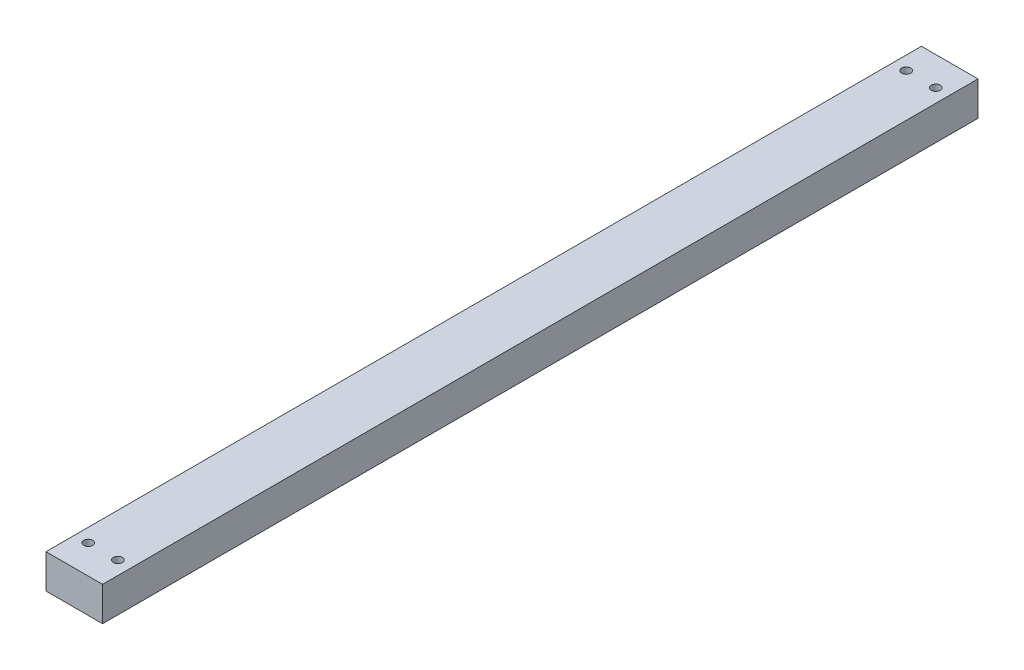
ISO-10303-21;
HEADER;
FILE_DESCRIPTION(('STEP AP214'),'2;1');
FILE_NAME('part.step','',(''),(''),'','','');
FILE_SCHEMA(('AUTOMOTIVE_DESIGN { 1 0 10303 214 1 1 1 1 }'));
ENDSEC;
DATA;
#1=APPLICATION_CONTEXT('core data for automotive mechanical design processes');
#2=APPLICATION_PROTOCOL_DEFINITION('international standard','automotive_design',2000,#1);
#3=PRODUCT_CONTEXT('',#1,'mechanical');
#4=PRODUCT('Part','Part','',(#3));
#5=PRODUCT_RELATED_PRODUCT_CATEGORY('part','',(#4));
#6=PRODUCT_DEFINITION_FORMATION('','',#4);
#7=PRODUCT_DEFINITION_CONTEXT('part definition',#1,'design');
#8=PRODUCT_DEFINITION('design','',#6,#7);
#9=PRODUCT_DEFINITION_SHAPE('','',#8);
#10=(LENGTH_UNIT() NAMED_UNIT(*) SI_UNIT(.MILLI.,.METRE.));
#11=(NAMED_UNIT(*) PLANE_ANGLE_UNIT() SI_UNIT($,.RADIAN.));
#12=(NAMED_UNIT(*) SI_UNIT($,.STERADIAN.) SOLID_ANGLE_UNIT());
#13=UNCERTAINTY_MEASURE_WITH_UNIT(LENGTH_MEASURE(1.E-05),#10,'distance_accuracy_value','');
#14=(GEOMETRIC_REPRESENTATION_CONTEXT(3) GLOBAL_UNCERTAINTY_ASSIGNED_CONTEXT((#13)) GLOBAL_UNIT_ASSIGNED_CONTEXT((#10,
#11,#12)) REPRESENTATION_CONTEXT('',''));
#15=CARTESIAN_POINT('',(0.,0.,0.));
#16=DIRECTION('',(0.,0.,1.));
#17=DIRECTION('',(1.,0.,0.));
#18=AXIS2_PLACEMENT_3D('',#15,#16,#17);
#19=CARTESIAN_POINT('',(0.,0.,975.));
#20=DIRECTION('',(1.,0.,0.));
#21=DIRECTION('',(0.,0.,-1.));
#22=AXIS2_PLACEMENT_3D('',#19,#20,#21);
#23=PLANE('',#22);
#24=DIRECTION('',(0.,-1.,0.));
#25=VECTOR('',#24,1.);
#26=CARTESIAN_POINT('',(0.,0.,0.));
#27=LINE('',#26,#25);
#28=CARTESIAN_POINT('',(0.,38.,0.));
#29=VERTEX_POINT('',#28);
#30=CARTESIAN_POINT('',(0.,0.,0.));
#31=VERTEX_POINT('',#30);
#32=EDGE_CURVE('E96',#29,#31,#27,.T.);
#33=ORIENTED_EDGE('',*,*,#32,.T.);
#34=DIRECTION('',(0.,0.,-1.));
#35=VECTOR('',#34,1.);
#36=CARTESIAN_POINT('',(0.,0.,975.));
#37=LINE('',#36,#35);
#38=CARTESIAN_POINT('',(0.,0.,975.));
#39=VERTEX_POINT('',#38);
#40=EDGE_CURVE('E11',#39,#31,#37,.T.);
#41=ORIENTED_EDGE('',*,*,#40,.F.);
#42=DIRECTION('',(0.,-1.,0.));
#43=VECTOR('',#42,1.);
#44=CARTESIAN_POINT('',(0.,0.,975.));
#45=LINE('',#44,#43);
#46=CARTESIAN_POINT('',(0.,38.,975.));
#47=VERTEX_POINT('',#46);
#48=EDGE_CURVE('E84',#47,#39,#45,.T.);
#49=ORIENTED_EDGE('',*,*,#48,.F.);
#50=DIRECTION('',(0.,0.,-1.));
#51=VECTOR('',#50,1.);
#52=CARTESIAN_POINT('',(0.,38.,975.));
#53=LINE('',#52,#51);
#54=EDGE_CURVE('E92',#47,#29,#53,.T.);
#55=ORIENTED_EDGE('',*,*,#54,.T.);
#56=EDGE_LOOP('',(#33,#41,#49,#55));
#57=FACE_BOUND('',#56,.T.);
#58=ADVANCED_FACE('F33',(#57),#23,.F.);
#59=CARTESIAN_POINT('',(0.,0.,975.));
#60=DIRECTION('',(0.,1.,0.));
#61=DIRECTION('',(0.,0.,1.));
#62=AXIS2_PLACEMENT_3D('',#59,#60,#61);
#63=PLANE('',#62);
#64=CARTESIAN_POINT('',(48.,0.,32.));
#65=DIRECTION('',(0.,1.,0.));
#66=DIRECTION('',(0.,0.,-1.));
#67=AXIS2_PLACEMENT_3D('',#64,#65,#66);
#68=CIRCLE('',#67,5.);
#69=CARTESIAN_POINT('',(48.,0.,27.));
#70=VERTEX_POINT('',#69);
#71=EDGE_CURVE('E113',#70,#70,#68,.T.);
#72=ORIENTED_EDGE('',*,*,#71,.T.);
#73=EDGE_LOOP('',(#72));
#74=FACE_BOUND('',#73,.T.);
#75=CARTESIAN_POINT('',(48.0000000000001,0.,943.));
#76=DIRECTION('',(0.,1.,0.));
#77=DIRECTION('',(0.,0.,1.));
#78=AXIS2_PLACEMENT_3D('',#75,#76,#77);
#79=CIRCLE('',#78,5.00000000000006);
#80=CARTESIAN_POINT('',(48.0000000000001,0.,948.));
#81=VERTEX_POINT('',#80);
#82=EDGE_CURVE('E125',#81,#81,#79,.T.);
#83=ORIENTED_EDGE('',*,*,#82,.T.);
#84=EDGE_LOOP('',(#83));
#85=FACE_BOUND('',#84,.T.);
#86=CARTESIAN_POINT('',(14.9999999999999,0.,943.));
#87=DIRECTION('',(0.,1.,0.));
#88=DIRECTION('',(0.,0.,-1.));
#89=AXIS2_PLACEMENT_3D('',#86,#87,#88);
#90=CIRCLE('',#89,5.00000000000006);
#91=CARTESIAN_POINT('',(14.9999999999999,0.,938.));
#92=VERTEX_POINT('',#91);
#93=EDGE_CURVE('E119',#92,#92,#90,.T.);
#94=ORIENTED_EDGE('',*,*,#93,.T.);
#95=EDGE_LOOP('',(#94));
#96=FACE_BOUND('',#95,.T.);
#97=CARTESIAN_POINT('',(15.,0.,32.));
#98=DIRECTION('',(0.,1.,0.));
#99=DIRECTION('',(0.,0.,1.));
#100=AXIS2_PLACEMENT_3D('',#97,#98,#99);
#101=CIRCLE('',#100,5.);
#102=CARTESIAN_POINT('',(15.,0.,37.));
#103=VERTEX_POINT('',#102);
#104=EDGE_CURVE('E99',#103,#103,#101,.T.);
#105=ORIENTED_EDGE('',*,*,#104,.T.);
#106=EDGE_LOOP('',(#105));
#107=FACE_BOUND('',#106,.T.);
#108=DIRECTION('',(1.,0.,0.));
#109=VECTOR('',#108,1.);
#110=CARTESIAN_POINT('',(0.,0.,0.));
#111=LINE('',#110,#109);
#112=CARTESIAN_POINT('',(63.,0.,0.));
#113=VERTEX_POINT('',#112);
#114=EDGE_CURVE('E88',#31,#113,#111,.T.);
#115=ORIENTED_EDGE('',*,*,#114,.T.);
#116=DIRECTION('',(0.,0.,-1.));
#117=VECTOR('',#116,1.);
#118=CARTESIAN_POINT('',(63.,0.,975.));
#119=LINE('',#118,#117);
#120=CARTESIAN_POINT('',(63.,0.,975.));
#121=VERTEX_POINT('',#120);
#122=EDGE_CURVE('E41',#121,#113,#119,.T.);
#123=ORIENTED_EDGE('',*,*,#122,.F.);
#124=DIRECTION('',(1.,0.,0.));
#125=VECTOR('',#124,1.);
#126=CARTESIAN_POINT('',(0.,0.,975.));
#127=LINE('',#126,#125);
#128=EDGE_CURVE('E79',#39,#121,#127,.T.);
#129=ORIENTED_EDGE('',*,*,#128,.F.);
#130=ORIENTED_EDGE('',*,*,#40,.T.);
#131=EDGE_LOOP('',(#115,#123,#129,#130));
#132=FACE_BOUND('',#131,.T.);
#133=ADVANCED_FACE('F87',(#74,#85,#96,#107,#132),#63,.F.);
#134=CARTESIAN_POINT('',(63.,0.,975.));
#135=DIRECTION('',(-1.,0.,0.));
#136=DIRECTION('',(0.,0.,1.));
#137=AXIS2_PLACEMENT_3D('',#134,#135,#136);
#138=PLANE('',#137);
#139=DIRECTION('',(0.,1.,0.));
#140=VECTOR('',#139,1.);
#141=CARTESIAN_POINT('',(63.,0.,0.));
#142=LINE('',#141,#140);
#143=CARTESIAN_POINT('',(63.,38.,0.));
#144=VERTEX_POINT('',#143);
#145=EDGE_CURVE('E66',#113,#144,#142,.T.);
#146=ORIENTED_EDGE('',*,*,#145,.T.);
#147=DIRECTION('',(0.,0.,-1.));
#148=VECTOR('',#147,1.);
#149=CARTESIAN_POINT('',(63.,38.,975.));
#150=LINE('',#149,#148);
#151=CARTESIAN_POINT('',(63.,38.,975.));
#152=VERTEX_POINT('',#151);
#153=EDGE_CURVE('E89',#152,#144,#150,.T.);
#154=ORIENTED_EDGE('',*,*,#153,.F.);
#155=DIRECTION('',(0.,1.,0.));
#156=VECTOR('',#155,1.);
#157=CARTESIAN_POINT('',(63.,0.,975.));
#158=LINE('',#157,#156);
#159=EDGE_CURVE('E82',#121,#152,#158,.T.);
#160=ORIENTED_EDGE('',*,*,#159,.F.);
#161=ORIENTED_EDGE('',*,*,#122,.T.);
#162=EDGE_LOOP('',(#146,#154,#160,#161));
#163=FACE_BOUND('',#162,.T.);
#164=ADVANCED_FACE('F90',(#163),#138,.F.);
#165=CARTESIAN_POINT('',(0.,38.,975.));
#166=DIRECTION('',(0.,-1.,0.));
#167=DIRECTION('',(0.,0.,-1.));
#168=AXIS2_PLACEMENT_3D('',#165,#166,#167);
#169=PLANE('',#168);
#170=CARTESIAN_POINT('',(48.,38.,32.));
#171=DIRECTION('',(0.,1.,0.));
#172=DIRECTION('',(0.,0.,-1.));
#173=AXIS2_PLACEMENT_3D('',#170,#171,#172);
#174=CIRCLE('',#173,5.);
#175=CARTESIAN_POINT('',(48.,38.,27.));
#176=VERTEX_POINT('',#175);
#177=EDGE_CURVE('E128',#176,#176,#174,.T.);
#178=ORIENTED_EDGE('',*,*,#177,.F.);
#179=EDGE_LOOP('',(#178));
#180=FACE_BOUND('',#179,.T.);
#181=CARTESIAN_POINT('',(48.0000000000001,38.,943.));
#182=DIRECTION('',(0.,1.,0.));
#183=DIRECTION('',(0.,0.,1.));
#184=AXIS2_PLACEMENT_3D('',#181,#182,#183);
#185=CIRCLE('',#184,5.00000000000006);
#186=CARTESIAN_POINT('',(48.0000000000001,38.,948.));
#187=VERTEX_POINT('',#186);
#188=EDGE_CURVE('E122',#187,#187,#185,.T.);
#189=ORIENTED_EDGE('',*,*,#188,.F.);
#190=EDGE_LOOP('',(#189));
#191=FACE_BOUND('',#190,.T.);
#192=CARTESIAN_POINT('',(14.9999999999999,38.,943.));
#193=DIRECTION('',(0.,1.,0.));
#194=DIRECTION('',(0.,0.,-1.));
#195=AXIS2_PLACEMENT_3D('',#192,#193,#194);
#196=CIRCLE('',#195,5.00000000000006);
#197=CARTESIAN_POINT('',(14.9999999999999,38.,938.));
#198=VERTEX_POINT('',#197);
#199=EDGE_CURVE('E116',#198,#198,#196,.T.);
#200=ORIENTED_EDGE('',*,*,#199,.F.);
#201=EDGE_LOOP('',(#200));
#202=FACE_BOUND('',#201,.T.);
#203=CARTESIAN_POINT('',(15.,38.,32.));
#204=DIRECTION('',(0.,1.,0.));
#205=DIRECTION('',(0.,0.,1.));
#206=AXIS2_PLACEMENT_3D('',#203,#204,#205);
#207=CIRCLE('',#206,5.);
#208=CARTESIAN_POINT('',(15.,38.,37.));
#209=VERTEX_POINT('',#208);
#210=EDGE_CURVE('E110',#209,#209,#207,.T.);
#211=ORIENTED_EDGE('',*,*,#210,.F.);
#212=EDGE_LOOP('',(#211));
#213=FACE_BOUND('',#212,.T.);
#214=DIRECTION('',(-1.,0.,0.));
#215=VECTOR('',#214,1.);
#216=CARTESIAN_POINT('',(0.,38.,0.));
#217=LINE('',#216,#215);
#218=EDGE_CURVE('E72',#144,#29,#217,.T.);
#219=ORIENTED_EDGE('',*,*,#218,.T.);
#220=ORIENTED_EDGE('',*,*,#54,.F.);
#221=DIRECTION('',(-1.,0.,0.));
#222=VECTOR('',#221,1.);
#223=CARTESIAN_POINT('',(0.,38.,975.));
#224=LINE('',#223,#222);
#225=EDGE_CURVE('E49',#152,#47,#224,.T.);
#226=ORIENTED_EDGE('',*,*,#225,.F.);
#227=ORIENTED_EDGE('',*,*,#153,.T.);
#228=EDGE_LOOP('',(#219,#220,#226,#227));
#229=FACE_BOUND('',#228,.T.);
#230=ADVANCED_FACE('F104',(#180,#191,#202,#213,#229),#169,.F.);
#231=CARTESIAN_POINT('',(0.,0.,975.));
#232=DIRECTION('',(0.,0.,-1.));
#233=DIRECTION('',(-1.,0.,0.));
#234=AXIS2_PLACEMENT_3D('',#231,#232,#233);
#235=PLANE('',#234);
#236=ORIENTED_EDGE('',*,*,#48,.T.);
#237=ORIENTED_EDGE('',*,*,#128,.T.);
#238=ORIENTED_EDGE('',*,*,#159,.T.);
#239=ORIENTED_EDGE('',*,*,#225,.T.);
#240=EDGE_LOOP('',(#236,#237,#238,#239));
#241=FACE_BOUND('',#240,.T.);
#242=ADVANCED_FACE('F80',(#241),#235,.F.);
#243=CARTESIAN_POINT('',(0.,0.,0.));
#244=DIRECTION('',(0.,0.,-1.));
#245=DIRECTION('',(-1.,0.,0.));
#246=AXIS2_PLACEMENT_3D('',#243,#244,#245);
#247=PLANE('',#246);
#248=ORIENTED_EDGE('',*,*,#32,.F.);
#249=ORIENTED_EDGE('',*,*,#218,.F.);
#250=ORIENTED_EDGE('',*,*,#145,.F.);
#251=ORIENTED_EDGE('',*,*,#114,.F.);
#252=EDGE_LOOP('',(#248,#249,#250,#251));
#253=FACE_BOUND('',#252,.T.);
#254=ADVANCED_FACE('F107',(#253),#247,.T.);
#255=CARTESIAN_POINT('',(15.,0.,32.));
#256=DIRECTION('',(0.,1.,0.));
#257=DIRECTION('',(0.,0.,1.));
#258=AXIS2_PLACEMENT_3D('',#255,#256,#257);
#259=CYLINDRICAL_SURFACE('',#258,5.);
#260=ORIENTED_EDGE('',*,*,#104,.F.);
#261=EDGE_LOOP('',(#260));
#262=FACE_BOUND('',#261,.T.);
#263=ORIENTED_EDGE('',*,*,#210,.T.);
#264=EDGE_LOOP('',(#263));
#265=FACE_BOUND('',#264,.T.);
#266=ADVANCED_FACE('F152',(#262,#265),#259,.F.);
#267=CARTESIAN_POINT('',(14.9999999999999,0.,943.));
#268=DIRECTION('',(0.,1.,0.));
#269=DIRECTION('',(0.,0.,1.));
#270=AXIS2_PLACEMENT_3D('',#267,#268,#269);
#271=CYLINDRICAL_SURFACE('',#270,5.00000000000006);
#272=ORIENTED_EDGE('',*,*,#93,.F.);
#273=EDGE_LOOP('',(#272));
#274=FACE_BOUND('',#273,.T.);
#275=ORIENTED_EDGE('',*,*,#199,.T.);
#276=EDGE_LOOP('',(#275));
#277=FACE_BOUND('',#276,.T.);
#278=ADVANCED_FACE('F154',(#274,#277),#271,.F.);
#279=CARTESIAN_POINT('',(48.0000000000001,0.,943.));
#280=DIRECTION('',(0.,1.,0.));
#281=DIRECTION('',(0.,0.,1.));
#282=AXIS2_PLACEMENT_3D('',#279,#280,#281);
#283=CYLINDRICAL_SURFACE('',#282,5.00000000000006);
#284=ORIENTED_EDGE('',*,*,#82,.F.);
#285=EDGE_LOOP('',(#284));
#286=FACE_BOUND('',#285,.T.);
#287=ORIENTED_EDGE('',*,*,#188,.T.);
#288=EDGE_LOOP('',(#287));
#289=FACE_BOUND('',#288,.T.);
#290=ADVANCED_FACE('F139',(#286,#289),#283,.F.);
#291=CARTESIAN_POINT('',(48.,0.,32.));
#292=DIRECTION('',(0.,1.,0.));
#293=DIRECTION('',(0.,0.,1.));
#294=AXIS2_PLACEMENT_3D('',#291,#292,#293);
#295=CYLINDRICAL_SURFACE('',#294,5.);
#296=ORIENTED_EDGE('',*,*,#71,.F.);
#297=EDGE_LOOP('',(#296));
#298=FACE_BOUND('',#297,.T.);
#299=ORIENTED_EDGE('',*,*,#177,.T.);
#300=EDGE_LOOP('',(#299));
#301=FACE_BOUND('',#300,.T.);
#302=ADVANCED_FACE('F136',(#298,#301),#295,.F.);
#303=CLOSED_SHELL('',(#58,#133,#164,#230,#242,#254,#266,#278,#290,#302));
#304=MANIFOLD_SOLID_BREP('B2',#303);
#305=ADVANCED_BREP_SHAPE_REPRESENTATION('',(#18,#304),#14);
#306=SHAPE_DEFINITION_REPRESENTATION(#9,#305);
ENDSEC;
END-ISO-10303-21;
